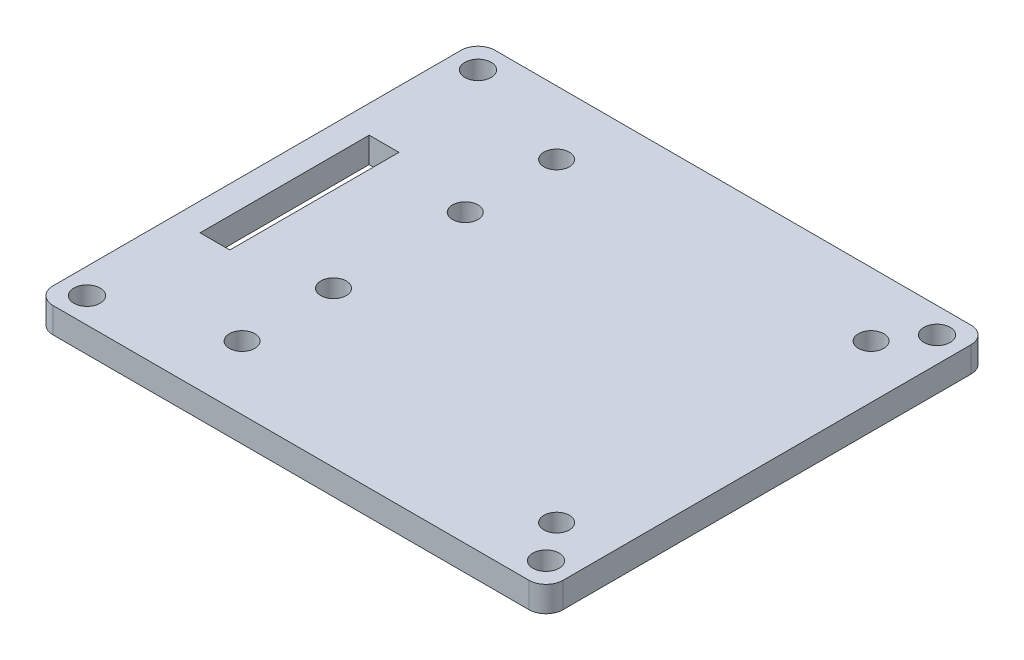
ISO-10303-21;
HEADER;
FILE_DESCRIPTION(('STEP AP214'),'2;1');
FILE_NAME('part.step','',(''),(''),'','','');
FILE_SCHEMA(('AUTOMOTIVE_DESIGN { 1 0 10303 214 1 1 1 1 }'));
ENDSEC;
DATA;
#1=APPLICATION_CONTEXT('core data for automotive mechanical design processes');
#2=APPLICATION_PROTOCOL_DEFINITION('international standard','automotive_design',2000,#1);
#3=PRODUCT_CONTEXT('',#1,'mechanical');
#4=PRODUCT('Part','Part','',(#3));
#5=PRODUCT_RELATED_PRODUCT_CATEGORY('part','',(#4));
#6=PRODUCT_DEFINITION_FORMATION('','',#4);
#7=PRODUCT_DEFINITION_CONTEXT('part definition',#1,'design');
#8=PRODUCT_DEFINITION('design','',#6,#7);
#9=PRODUCT_DEFINITION_SHAPE('','',#8);
#10=(LENGTH_UNIT() NAMED_UNIT(*) SI_UNIT(.MILLI.,.METRE.));
#11=(NAMED_UNIT(*) PLANE_ANGLE_UNIT() SI_UNIT($,.RADIAN.));
#12=(NAMED_UNIT(*) SI_UNIT($,.STERADIAN.) SOLID_ANGLE_UNIT());
#13=UNCERTAINTY_MEASURE_WITH_UNIT(LENGTH_MEASURE(1.E-05),#10,'distance_accuracy_value','');
#14=(GEOMETRIC_REPRESENTATION_CONTEXT(3) GLOBAL_UNCERTAINTY_ASSIGNED_CONTEXT((#13)) GLOBAL_UNIT_ASSIGNED_CONTEXT((#10,
#11,#12)) REPRESENTATION_CONTEXT('',''));
#15=CARTESIAN_POINT('',(0.,0.,0.));
#16=DIRECTION('',(0.,0.,1.));
#17=DIRECTION('',(1.,0.,0.));
#18=AXIS2_PLACEMENT_3D('',#15,#16,#17);
#19=CARTESIAN_POINT('',(0.,3.,0.));
#20=DIRECTION('',(0.,1.,0.));
#21=DIRECTION('',(0.,0.,1.));
#22=AXIS2_PLACEMENT_3D('',#19,#20,#21);
#23=PLANE('',#22);
#24=CARTESIAN_POINT('',(21.75,3.,23.));
#25=DIRECTION('',(0.,1.,0.));
#26=DIRECTION('',(0.,0.,1.));
#27=AXIS2_PLACEMENT_3D('',#24,#25,#26);
#28=CIRCLE('',#27,1.55);
#29=CARTESIAN_POINT('',(21.75,3.,24.55));
#30=VERTEX_POINT('',#29);
#31=EDGE_CURVE('E574',#30,#30,#28,.T.);
#32=ORIENTED_EDGE('',*,*,#31,.F.);
#33=EDGE_LOOP('',(#32));
#34=FACE_BOUND('',#33,.T.);
#35=CARTESIAN_POINT('',(-32.25,3.,-23.));
#36=DIRECTION('',(0.,1.,0.));
#37=DIRECTION('',(0.,0.,1.));
#38=AXIS2_PLACEMENT_3D('',#35,#36,#37);
#39=CIRCLE('',#38,1.55);
#40=CARTESIAN_POINT('',(-32.25,3.,-21.45));
#41=VERTEX_POINT('',#40);
#42=EDGE_CURVE('E170',#41,#41,#39,.T.);
#43=ORIENTED_EDGE('',*,*,#42,.F.);
#44=EDGE_LOOP('',(#43));
#45=FACE_BOUND('',#44,.T.);
#46=CARTESIAN_POINT('',(-18.5,3.,7.75));
#47=DIRECTION('',(0.,1.,0.));
#48=DIRECTION('',(0.,0.,1.));
#49=AXIS2_PLACEMENT_3D('',#46,#47,#48);
#50=CIRCLE('',#49,1.49999999999998);
#51=CARTESIAN_POINT('',(-18.5,3.,9.24999999999998));
#52=VERTEX_POINT('',#51);
#53=EDGE_CURVE('E195',#52,#52,#50,.T.);
#54=ORIENTED_EDGE('',*,*,#53,.F.);
#55=EDGE_LOOP('',(#54));
#56=FACE_BOUND('',#55,.T.);
#57=CARTESIAN_POINT('',(18.5,3.,-18.5));
#58=DIRECTION('',(0.,1.,0.));
#59=DIRECTION('',(0.,0.,1.));
#60=AXIS2_PLACEMENT_3D('',#57,#58,#59);
#61=CIRCLE('',#60,1.5);
#62=CARTESIAN_POINT('',(18.5,3.,-17.));
#63=VERTEX_POINT('',#62);
#64=EDGE_CURVE('E211',#63,#63,#61,.T.);
#65=ORIENTED_EDGE('',*,*,#64,.F.);
#66=EDGE_LOOP('',(#65));
#67=FACE_BOUND('',#66,.T.);
#68=CARTESIAN_POINT('',(-18.5,3.,18.5));
#69=DIRECTION('',(0.,1.,0.));
#70=DIRECTION('',(0.,0.,1.));
#71=AXIS2_PLACEMENT_3D('',#68,#69,#70);
#72=CIRCLE('',#71,1.5);
#73=CARTESIAN_POINT('',(-18.5,3.,20.));
#74=VERTEX_POINT('',#73);
#75=EDGE_CURVE('E227',#74,#74,#72,.T.);
#76=ORIENTED_EDGE('',*,*,#75,.F.);
#77=EDGE_LOOP('',(#76));
#78=FACE_BOUND('',#77,.T.);
#79=DIRECTION('',(-1.,0.,0.));
#80=VECTOR('',#79,1.);
#81=CARTESIAN_POINT('',(-35.25,3.,-26.));
#82=LINE('',#81,#80);
#83=CARTESIAN_POINT('',(22.75,3.,-26.));
#84=VERTEX_POINT('',#83);
#85=CARTESIAN_POINT('',(-33.25,3.,-26.));
#86=VERTEX_POINT('',#85);
#87=EDGE_CURVE('E246',#84,#86,#82,.T.);
#88=ORIENTED_EDGE('',*,*,#87,.T.);
#89=CARTESIAN_POINT('',(-33.25,3.,-24.));
#90=DIRECTION('',(0.,1.,0.));
#91=DIRECTION('',(0.,0.,1.));
#92=AXIS2_PLACEMENT_3D('',#89,#90,#91);
#93=CIRCLE('',#92,2.);
#94=CARTESIAN_POINT('',(-35.25,3.,-24.));
#95=VERTEX_POINT('',#94);
#96=EDGE_CURVE('E297',#86,#95,#93,.T.);
#97=ORIENTED_EDGE('',*,*,#96,.T.);
#98=DIRECTION('',(0.,0.,1.));
#99=VECTOR('',#98,1.);
#100=CARTESIAN_POINT('',(-35.25,3.,-26.));
#101=LINE('',#100,#99);
#102=CARTESIAN_POINT('',(-35.25,3.,24.));
#103=VERTEX_POINT('',#102);
#104=EDGE_CURVE('E235',#95,#103,#101,.T.);
#105=ORIENTED_EDGE('',*,*,#104,.T.);
#106=CARTESIAN_POINT('',(-33.25,3.,24.));
#107=DIRECTION('',(0.,1.,0.));
#108=DIRECTION('',(0.,0.,1.));
#109=AXIS2_PLACEMENT_3D('',#106,#107,#108);
#110=CIRCLE('',#109,2.);
#111=CARTESIAN_POINT('',(-33.25,3.,26.));
#112=VERTEX_POINT('',#111);
#113=EDGE_CURVE('E294',#103,#112,#110,.T.);
#114=ORIENTED_EDGE('',*,*,#113,.T.);
#115=DIRECTION('',(1.,0.,0.));
#116=VECTOR('',#115,1.);
#117=CARTESIAN_POINT('',(-35.25,3.,26.));
#118=LINE('',#117,#116);
#119=CARTESIAN_POINT('',(22.75,3.,26.));
#120=VERTEX_POINT('',#119);
#121=EDGE_CURVE('E239',#112,#120,#118,.T.);
#122=ORIENTED_EDGE('',*,*,#121,.T.);
#123=CARTESIAN_POINT('',(22.75,3.,24.));
#124=DIRECTION('',(0.,1.,0.));
#125=DIRECTION('',(0.,0.,1.));
#126=AXIS2_PLACEMENT_3D('',#123,#124,#125);
#127=CIRCLE('',#126,2.);
#128=CARTESIAN_POINT('',(24.75,3.,24.));
#129=VERTEX_POINT('',#128);
#130=EDGE_CURVE('E61',#120,#129,#127,.T.);
#131=ORIENTED_EDGE('',*,*,#130,.T.);
#132=DIRECTION('',(0.,0.,-1.));
#133=VECTOR('',#132,1.);
#134=CARTESIAN_POINT('',(24.75,3.,-26.));
#135=LINE('',#134,#133);
#136=CARTESIAN_POINT('',(24.75,3.,-24.));
#137=VERTEX_POINT('',#136);
#138=EDGE_CURVE('E243',#129,#137,#135,.T.);
#139=ORIENTED_EDGE('',*,*,#138,.T.);
#140=CARTESIAN_POINT('',(22.75,3.,-24.));
#141=DIRECTION('',(0.,1.,0.));
#142=DIRECTION('',(0.,0.,1.));
#143=AXIS2_PLACEMENT_3D('',#140,#141,#142);
#144=CIRCLE('',#143,2.);
#145=EDGE_CURVE('E289',#137,#84,#144,.T.);
#146=ORIENTED_EDGE('',*,*,#145,.T.);
#147=EDGE_LOOP('',(#88,#97,#105,#114,#122,#131,#139,#146));
#148=FACE_BOUND('',#147,.T.);
#149=CARTESIAN_POINT('',(-18.5,3.,-18.5));
#150=DIRECTION('',(0.,1.,0.));
#151=DIRECTION('',(0.,0.,1.));
#152=AXIS2_PLACEMENT_3D('',#149,#150,#151);
#153=CIRCLE('',#152,1.5);
#154=CARTESIAN_POINT('',(-18.5,3.,-17.));
#155=VERTEX_POINT('',#154);
#156=EDGE_CURVE('E219',#155,#155,#153,.T.);
#157=ORIENTED_EDGE('',*,*,#156,.F.);
#158=EDGE_LOOP('',(#157));
#159=FACE_BOUND('',#158,.T.);
#160=CARTESIAN_POINT('',(18.5,3.,18.5));
#161=DIRECTION('',(0.,1.,0.));
#162=DIRECTION('',(0.,0.,1.));
#163=AXIS2_PLACEMENT_3D('',#160,#161,#162);
#164=CIRCLE('',#163,1.5);
#165=CARTESIAN_POINT('',(18.5,3.,20.));
#166=VERTEX_POINT('',#165);
#167=EDGE_CURVE('E203',#166,#166,#164,.T.);
#168=ORIENTED_EDGE('',*,*,#167,.F.);
#169=EDGE_LOOP('',(#168));
#170=FACE_BOUND('',#169,.T.);
#171=CARTESIAN_POINT('',(-18.5,3.,-7.75));
#172=DIRECTION('',(0.,1.,0.));
#173=DIRECTION('',(0.,0.,1.));
#174=AXIS2_PLACEMENT_3D('',#171,#172,#173);
#175=CIRCLE('',#174,1.49999999999998);
#176=CARTESIAN_POINT('',(-18.5,3.,-6.25000000000002));
#177=VERTEX_POINT('',#176);
#178=EDGE_CURVE('E187',#177,#177,#175,.T.);
#179=ORIENTED_EDGE('',*,*,#178,.F.);
#180=EDGE_LOOP('',(#179));
#181=FACE_BOUND('',#180,.T.);
#182=DIRECTION('',(-1.,0.,0.));
#183=VECTOR('',#182,1.);
#184=CARTESIAN_POINT('',(-28.5,3.,-9.95));
#185=LINE('',#184,#183);
#186=CARTESIAN_POINT('',(-28.5,3.,-9.95));
#187=VERTEX_POINT('',#186);
#188=CARTESIAN_POINT('',(-32.,3.,-9.94999999999999));
#189=VERTEX_POINT('',#188);
#190=EDGE_CURVE('E142',#187,#189,#185,.T.);
#191=ORIENTED_EDGE('',*,*,#190,.F.);
#192=DIRECTION('',(0.,0.,-1.));
#193=VECTOR('',#192,1.);
#194=CARTESIAN_POINT('',(-28.5,3.,-9.95));
#195=LINE('',#194,#193);
#196=CARTESIAN_POINT('',(-28.5,3.,9.95));
#197=VERTEX_POINT('',#196);
#198=EDGE_CURVE('E131',#197,#187,#195,.T.);
#199=ORIENTED_EDGE('',*,*,#198,.F.);
#200=DIRECTION('',(1.,0.,0.));
#201=VECTOR('',#200,1.);
#202=CARTESIAN_POINT('',(-28.5,3.,9.95));
#203=LINE('',#202,#201);
#204=CARTESIAN_POINT('',(-32.,3.,9.95));
#205=VERTEX_POINT('',#204);
#206=EDGE_CURVE('E161',#205,#197,#203,.T.);
#207=ORIENTED_EDGE('',*,*,#206,.F.);
#208=DIRECTION('',(0.,0.,1.));
#209=VECTOR('',#208,1.);
#210=CARTESIAN_POINT('',(-32.,3.,-9.94999999999999));
#211=LINE('',#210,#209);
#212=EDGE_CURVE('E157',#189,#205,#211,.T.);
#213=ORIENTED_EDGE('',*,*,#212,.F.);
#214=EDGE_LOOP('',(#191,#199,#207,#213));
#215=FACE_BOUND('',#214,.T.);
#216=CARTESIAN_POINT('',(21.75,3.,-23.));
#217=DIRECTION('',(0.,1.,0.));
#218=DIRECTION('',(0.,0.,1.));
#219=AXIS2_PLACEMENT_3D('',#216,#217,#218);
#220=CIRCLE('',#219,1.55);
#221=CARTESIAN_POINT('',(21.75,3.,-21.45));
#222=VERTEX_POINT('',#221);
#223=EDGE_CURVE('E582',#222,#222,#220,.T.);
#224=ORIENTED_EDGE('',*,*,#223,.F.);
#225=EDGE_LOOP('',(#224));
#226=FACE_BOUND('',#225,.T.);
#227=CARTESIAN_POINT('',(-32.25,3.,23.));
#228=DIRECTION('',(0.,1.,0.));
#229=DIRECTION('',(0.,0.,1.));
#230=AXIS2_PLACEMENT_3D('',#227,#228,#229);
#231=CIRCLE('',#230,1.55);
#232=CARTESIAN_POINT('',(-32.25,3.,24.55));
#233=VERTEX_POINT('',#232);
#234=EDGE_CURVE('E563',#233,#233,#231,.T.);
#235=ORIENTED_EDGE('',*,*,#234,.F.);
#236=EDGE_LOOP('',(#235));
#237=FACE_BOUND('',#236,.T.);
#238=ADVANCED_FACE('F39',(#34,#45,#56,#67,#78,#148,#159,#170,#181,#215,#226,#237),#23,.T.);
#239=CARTESIAN_POINT('',(0.,0.,0.));
#240=DIRECTION('',(0.,1.,0.));
#241=DIRECTION('',(0.,0.,1.));
#242=AXIS2_PLACEMENT_3D('',#239,#240,#241);
#243=PLANE('',#242);
#244=CARTESIAN_POINT('',(-18.5,0.,-7.75));
#245=DIRECTION('',(0.,1.,0.));
#246=DIRECTION('',(0.,0.,1.));
#247=AXIS2_PLACEMENT_3D('',#244,#245,#246);
#248=CIRCLE('',#247,1.49999999999998);
#249=CARTESIAN_POINT('',(-18.5,0.,-6.25000000000002));
#250=VERTEX_POINT('',#249);
#251=EDGE_CURVE('E151',#250,#250,#248,.T.);
#252=ORIENTED_EDGE('',*,*,#251,.T.);
#253=EDGE_LOOP('',(#252));
#254=FACE_BOUND('',#253,.T.);
#255=CARTESIAN_POINT('',(-18.5,0.,7.75));
#256=DIRECTION('',(0.,1.,0.));
#257=DIRECTION('',(0.,0.,1.));
#258=AXIS2_PLACEMENT_3D('',#255,#256,#257);
#259=CIRCLE('',#258,1.49999999999998);
#260=CARTESIAN_POINT('',(-18.5,0.,9.24999999999998));
#261=VERTEX_POINT('',#260);
#262=EDGE_CURVE('E191',#261,#261,#259,.T.);
#263=ORIENTED_EDGE('',*,*,#262,.T.);
#264=EDGE_LOOP('',(#263));
#265=FACE_BOUND('',#264,.T.);
#266=CARTESIAN_POINT('',(18.5,0.,18.5));
#267=DIRECTION('',(0.,1.,0.));
#268=DIRECTION('',(0.,0.,1.));
#269=AXIS2_PLACEMENT_3D('',#266,#267,#268);
#270=CIRCLE('',#269,1.5);
#271=CARTESIAN_POINT('',(18.5,0.,20.));
#272=VERTEX_POINT('',#271);
#273=EDGE_CURVE('E199',#272,#272,#270,.T.);
#274=ORIENTED_EDGE('',*,*,#273,.T.);
#275=EDGE_LOOP('',(#274));
#276=FACE_BOUND('',#275,.T.);
#277=CARTESIAN_POINT('',(18.5,0.,-18.5));
#278=DIRECTION('',(0.,1.,0.));
#279=DIRECTION('',(0.,0.,1.));
#280=AXIS2_PLACEMENT_3D('',#277,#278,#279);
#281=CIRCLE('',#280,1.5);
#282=CARTESIAN_POINT('',(18.5,0.,-17.));
#283=VERTEX_POINT('',#282);
#284=EDGE_CURVE('E207',#283,#283,#281,.T.);
#285=ORIENTED_EDGE('',*,*,#284,.T.);
#286=EDGE_LOOP('',(#285));
#287=FACE_BOUND('',#286,.T.);
#288=CARTESIAN_POINT('',(-18.5,0.,-18.5));
#289=DIRECTION('',(0.,1.,0.));
#290=DIRECTION('',(0.,0.,1.));
#291=AXIS2_PLACEMENT_3D('',#288,#289,#290);
#292=CIRCLE('',#291,1.5);
#293=CARTESIAN_POINT('',(-18.5,0.,-17.));
#294=VERTEX_POINT('',#293);
#295=EDGE_CURVE('E215',#294,#294,#292,.T.);
#296=ORIENTED_EDGE('',*,*,#295,.T.);
#297=EDGE_LOOP('',(#296));
#298=FACE_BOUND('',#297,.T.);
#299=CARTESIAN_POINT('',(-18.5,0.,18.5));
#300=DIRECTION('',(0.,1.,0.));
#301=DIRECTION('',(0.,0.,1.));
#302=AXIS2_PLACEMENT_3D('',#299,#300,#301);
#303=CIRCLE('',#302,1.5);
#304=CARTESIAN_POINT('',(-18.5,0.,20.));
#305=VERTEX_POINT('',#304);
#306=EDGE_CURVE('E223',#305,#305,#303,.T.);
#307=ORIENTED_EDGE('',*,*,#306,.T.);
#308=EDGE_LOOP('',(#307));
#309=FACE_BOUND('',#308,.T.);
#310=DIRECTION('',(0.,0.,1.));
#311=VECTOR('',#310,1.);
#312=CARTESIAN_POINT('',(-35.25,0.,-26.));
#313=LINE('',#312,#311);
#314=CARTESIAN_POINT('',(-35.25,0.,-24.));
#315=VERTEX_POINT('',#314);
#316=CARTESIAN_POINT('',(-35.25,0.,24.));
#317=VERTEX_POINT('',#316);
#318=EDGE_CURVE('E231',#315,#317,#313,.T.);
#319=ORIENTED_EDGE('',*,*,#318,.F.);
#320=CARTESIAN_POINT('',(-33.25,0.,-24.));
#321=DIRECTION('',(0.,1.,0.));
#322=DIRECTION('',(0.,0.,1.));
#323=AXIS2_PLACEMENT_3D('',#320,#321,#322);
#324=CIRCLE('',#323,2.);
#325=CARTESIAN_POINT('',(-33.25,0.,-26.));
#326=VERTEX_POINT('',#325);
#327=EDGE_CURVE('E279',#315,#326,#324,.F.);
#328=ORIENTED_EDGE('',*,*,#327,.T.);
#329=DIRECTION('',(-1.,0.,0.));
#330=VECTOR('',#329,1.);
#331=CARTESIAN_POINT('',(-35.25,0.,-26.));
#332=LINE('',#331,#330);
#333=CARTESIAN_POINT('',(22.75,0.,-26.));
#334=VERTEX_POINT('',#333);
#335=EDGE_CURVE('E240',#334,#326,#332,.T.);
#336=ORIENTED_EDGE('',*,*,#335,.F.);
#337=CARTESIAN_POINT('',(22.75,0.,-24.));
#338=DIRECTION('',(0.,1.,0.));
#339=DIRECTION('',(0.,0.,1.));
#340=AXIS2_PLACEMENT_3D('',#337,#338,#339);
#341=CIRCLE('',#340,2.);
#342=CARTESIAN_POINT('',(24.75,0.,-24.));
#343=VERTEX_POINT('',#342);
#344=EDGE_CURVE('E270',#334,#343,#341,.F.);
#345=ORIENTED_EDGE('',*,*,#344,.T.);
#346=DIRECTION('',(0.,0.,-1.));
#347=VECTOR('',#346,1.);
#348=CARTESIAN_POINT('',(24.75,0.,-26.));
#349=LINE('',#348,#347);
#350=CARTESIAN_POINT('',(24.75,0.,24.));
#351=VERTEX_POINT('',#350);
#352=EDGE_CURVE('E258',#351,#343,#349,.T.);
#353=ORIENTED_EDGE('',*,*,#352,.F.);
#354=CARTESIAN_POINT('',(22.75,0.,24.));
#355=DIRECTION('',(0.,1.,0.));
#356=DIRECTION('',(0.,0.,1.));
#357=AXIS2_PLACEMENT_3D('',#354,#355,#356);
#358=CIRCLE('',#357,2.);
#359=CARTESIAN_POINT('',(22.75,0.,26.));
#360=VERTEX_POINT('',#359);
#361=EDGE_CURVE('E273',#351,#360,#358,.F.);
#362=ORIENTED_EDGE('',*,*,#361,.T.);
#363=DIRECTION('',(1.,0.,0.));
#364=VECTOR('',#363,1.);
#365=CARTESIAN_POINT('',(-35.25,0.,26.));
#366=LINE('',#365,#364);
#367=CARTESIAN_POINT('',(-33.25,0.,26.));
#368=VERTEX_POINT('',#367);
#369=EDGE_CURVE('E254',#368,#360,#366,.T.);
#370=ORIENTED_EDGE('',*,*,#369,.F.);
#371=CARTESIAN_POINT('',(-33.25,0.,24.));
#372=DIRECTION('',(0.,1.,0.));
#373=DIRECTION('',(0.,0.,1.));
#374=AXIS2_PLACEMENT_3D('',#371,#372,#373);
#375=CIRCLE('',#374,2.);
#376=EDGE_CURVE('E276',#368,#317,#375,.F.);
#377=ORIENTED_EDGE('',*,*,#376,.T.);
#378=EDGE_LOOP('',(#319,#328,#336,#345,#353,#362,#370,#377));
#379=FACE_BOUND('',#378,.T.);
#380=DIRECTION('',(0.,0.,-1.));
#381=VECTOR('',#380,1.);
#382=CARTESIAN_POINT('',(-28.5,0.,-9.95));
#383=LINE('',#382,#381);
#384=CARTESIAN_POINT('',(-28.5,0.,9.95));
#385=VERTEX_POINT('',#384);
#386=CARTESIAN_POINT('',(-28.5,0.,-9.95));
#387=VERTEX_POINT('',#386);
#388=EDGE_CURVE('E167',#385,#387,#383,.T.);
#389=ORIENTED_EDGE('',*,*,#388,.T.);
#390=DIRECTION('',(-1.,0.,0.));
#391=VECTOR('',#390,1.);
#392=CARTESIAN_POINT('',(-28.5,0.,-9.95));
#393=LINE('',#392,#391);
#394=CARTESIAN_POINT('',(-32.,0.,-9.94999999999999));
#395=VERTEX_POINT('',#394);
#396=EDGE_CURVE('E149',#387,#395,#393,.T.);
#397=ORIENTED_EDGE('',*,*,#396,.T.);
#398=DIRECTION('',(0.,0.,1.));
#399=VECTOR('',#398,1.);
#400=CARTESIAN_POINT('',(-32.,0.,-9.94999999999999));
#401=LINE('',#400,#399);
#402=CARTESIAN_POINT('',(-32.,0.,9.95));
#403=VERTEX_POINT('',#402);
#404=EDGE_CURVE('E173',#395,#403,#401,.T.);
#405=ORIENTED_EDGE('',*,*,#404,.T.);
#406=DIRECTION('',(1.,0.,0.));
#407=VECTOR('',#406,1.);
#408=CARTESIAN_POINT('',(-28.5,0.,9.95));
#409=LINE('',#408,#407);
#410=EDGE_CURVE('E143',#403,#385,#409,.T.);
#411=ORIENTED_EDGE('',*,*,#410,.T.);
#412=EDGE_LOOP('',(#389,#397,#405,#411));
#413=FACE_BOUND('',#412,.T.);
#414=CARTESIAN_POINT('',(-32.25,0.,-23.));
#415=DIRECTION('',(0.,1.,0.));
#416=DIRECTION('',(0.,0.,1.));
#417=AXIS2_PLACEMENT_3D('',#414,#415,#416);
#418=CIRCLE('',#417,1.55);
#419=CARTESIAN_POINT('',(-32.25,0.,-21.45));
#420=VERTEX_POINT('',#419);
#421=EDGE_CURVE('E586',#420,#420,#418,.T.);
#422=ORIENTED_EDGE('',*,*,#421,.T.);
#423=EDGE_LOOP('',(#422));
#424=FACE_BOUND('',#423,.T.);
#425=CARTESIAN_POINT('',(21.75,0.,-23.));
#426=DIRECTION('',(0.,1.,0.));
#427=DIRECTION('',(0.,0.,1.));
#428=AXIS2_PLACEMENT_3D('',#425,#426,#427);
#429=CIRCLE('',#428,1.55);
#430=CARTESIAN_POINT('',(21.75,0.,-21.45));
#431=VERTEX_POINT('',#430);
#432=EDGE_CURVE('E578',#431,#431,#429,.T.);
#433=ORIENTED_EDGE('',*,*,#432,.T.);
#434=EDGE_LOOP('',(#433));
#435=FACE_BOUND('',#434,.T.);
#436=CARTESIAN_POINT('',(21.75,0.,23.));
#437=DIRECTION('',(0.,1.,0.));
#438=DIRECTION('',(0.,0.,1.));
#439=AXIS2_PLACEMENT_3D('',#436,#437,#438);
#440=CIRCLE('',#439,1.55);
#441=CARTESIAN_POINT('',(21.75,0.,24.55));
#442=VERTEX_POINT('',#441);
#443=EDGE_CURVE('E571',#442,#442,#440,.T.);
#444=ORIENTED_EDGE('',*,*,#443,.T.);
#445=EDGE_LOOP('',(#444));
#446=FACE_BOUND('',#445,.T.);
#447=CARTESIAN_POINT('',(-32.25,0.,23.));
#448=DIRECTION('',(0.,1.,0.));
#449=DIRECTION('',(0.,0.,1.));
#450=AXIS2_PLACEMENT_3D('',#447,#448,#449);
#451=CIRCLE('',#450,1.55);
#452=CARTESIAN_POINT('',(-32.25,0.,24.55));
#453=VERTEX_POINT('',#452);
#454=EDGE_CURVE('E566',#453,#453,#451,.T.);
#455=ORIENTED_EDGE('',*,*,#454,.T.);
#456=EDGE_LOOP('',(#455));
#457=FACE_BOUND('',#456,.T.);
#458=ADVANCED_FACE('F317',(#254,#265,#276,#287,#298,#309,#379,#413,#424,#435,#446,#457),#243,.F.);
#459=CARTESIAN_POINT('',(-35.25,3.,-26.));
#460=DIRECTION('',(1.,0.,0.));
#461=DIRECTION('',(0.,0.,-1.));
#462=AXIS2_PLACEMENT_3D('',#459,#460,#461);
#463=PLANE('',#462);
#464=ORIENTED_EDGE('',*,*,#104,.F.);
#465=DIRECTION('',(0.,-1.,0.));
#466=VECTOR('',#465,1.);
#467=CARTESIAN_POINT('',(-35.25,3.,-24.));
#468=LINE('',#467,#466);
#469=EDGE_CURVE('E266',#95,#315,#468,.T.);
#470=ORIENTED_EDGE('',*,*,#469,.T.);
#471=ORIENTED_EDGE('',*,*,#318,.T.);
#472=DIRECTION('',(0.,-1.,0.));
#473=VECTOR('',#472,1.);
#474=CARTESIAN_POINT('',(-35.25,3.,24.));
#475=LINE('',#474,#473);
#476=EDGE_CURVE('E250',#317,#103,#475,.F.);
#477=ORIENTED_EDGE('',*,*,#476,.T.);
#478=EDGE_LOOP('',(#464,#470,#471,#477));
#479=FACE_BOUND('',#478,.T.);
#480=ADVANCED_FACE('F339',(#479),#463,.F.);
#481=CARTESIAN_POINT('',(-35.25,3.,26.));
#482=DIRECTION('',(0.,0.,-1.));
#483=DIRECTION('',(-1.,0.,0.));
#484=AXIS2_PLACEMENT_3D('',#481,#482,#483);
#485=PLANE('',#484);
#486=ORIENTED_EDGE('',*,*,#121,.F.);
#487=DIRECTION('',(0.,-1.,0.));
#488=VECTOR('',#487,1.);
#489=CARTESIAN_POINT('',(-33.25,3.,26.));
#490=LINE('',#489,#488);
#491=EDGE_CURVE('E303',#112,#368,#490,.T.);
#492=ORIENTED_EDGE('',*,*,#491,.T.);
#493=ORIENTED_EDGE('',*,*,#369,.T.);
#494=DIRECTION('',(0.,-1.,0.));
#495=VECTOR('',#494,1.);
#496=CARTESIAN_POINT('',(22.75,3.,26.));
#497=LINE('',#496,#495);
#498=EDGE_CURVE('E300',#360,#120,#497,.F.);
#499=ORIENTED_EDGE('',*,*,#498,.T.);
#500=EDGE_LOOP('',(#486,#492,#493,#499));
#501=FACE_BOUND('',#500,.T.);
#502=ADVANCED_FACE('F311',(#501),#485,.F.);
#503=CARTESIAN_POINT('',(24.75,3.,-26.));
#504=DIRECTION('',(-1.,0.,0.));
#505=DIRECTION('',(0.,0.,1.));
#506=AXIS2_PLACEMENT_3D('',#503,#504,#505);
#507=PLANE('',#506);
#508=ORIENTED_EDGE('',*,*,#138,.F.);
#509=DIRECTION('',(0.,-1.,0.));
#510=VECTOR('',#509,1.);
#511=CARTESIAN_POINT('',(24.75,3.,24.));
#512=LINE('',#511,#510);
#513=EDGE_CURVE('E11',#129,#351,#512,.T.);
#514=ORIENTED_EDGE('',*,*,#513,.T.);
#515=ORIENTED_EDGE('',*,*,#352,.T.);
#516=DIRECTION('',(0.,-1.,0.));
#517=VECTOR('',#516,1.);
#518=CARTESIAN_POINT('',(24.75,3.,-24.));
#519=LINE('',#518,#517);
#520=EDGE_CURVE('E48',#343,#137,#519,.F.);
#521=ORIENTED_EDGE('',*,*,#520,.T.);
#522=EDGE_LOOP('',(#508,#514,#515,#521));
#523=FACE_BOUND('',#522,.T.);
#524=ADVANCED_FACE('F323',(#523),#507,.F.);
#525=CARTESIAN_POINT('',(-35.25,3.,-26.));
#526=DIRECTION('',(0.,0.,1.));
#527=DIRECTION('',(1.,0.,0.));
#528=AXIS2_PLACEMENT_3D('',#525,#526,#527);
#529=PLANE('',#528);
#530=ORIENTED_EDGE('',*,*,#335,.T.);
#531=DIRECTION('',(0.,-1.,0.));
#532=VECTOR('',#531,1.);
#533=CARTESIAN_POINT('',(-33.25,3.,-26.));
#534=LINE('',#533,#532);
#535=EDGE_CURVE('E286',#326,#86,#534,.F.);
#536=ORIENTED_EDGE('',*,*,#535,.T.);
#537=ORIENTED_EDGE('',*,*,#87,.F.);
#538=DIRECTION('',(0.,-1.,0.));
#539=VECTOR('',#538,1.);
#540=CARTESIAN_POINT('',(22.75,3.,-26.));
#541=LINE('',#540,#539);
#542=EDGE_CURVE('E282',#84,#334,#541,.T.);
#543=ORIENTED_EDGE('',*,*,#542,.T.);
#544=EDGE_LOOP('',(#530,#536,#537,#543));
#545=FACE_BOUND('',#544,.T.);
#546=ADVANCED_FACE('F331',(#545),#529,.F.);
#547=CARTESIAN_POINT('',(-18.5,3.,18.5));
#548=DIRECTION('',(0.,-1.,0.));
#549=DIRECTION('',(0.,0.,-1.));
#550=AXIS2_PLACEMENT_3D('',#547,#548,#549);
#551=CYLINDRICAL_SURFACE('',#550,1.5);
#552=ORIENTED_EDGE('',*,*,#75,.T.);
#553=EDGE_LOOP('',(#552));
#554=FACE_BOUND('',#553,.T.);
#555=ORIENTED_EDGE('',*,*,#306,.F.);
#556=EDGE_LOOP('',(#555));
#557=FACE_BOUND('',#556,.T.);
#558=ADVANCED_FACE('F361',(#554,#557),#551,.F.);
#559=CARTESIAN_POINT('',(-18.5,3.,-18.5));
#560=DIRECTION('',(0.,-1.,0.));
#561=DIRECTION('',(0.,0.,-1.));
#562=AXIS2_PLACEMENT_3D('',#559,#560,#561);
#563=CYLINDRICAL_SURFACE('',#562,1.5);
#564=ORIENTED_EDGE('',*,*,#156,.T.);
#565=EDGE_LOOP('',(#564));
#566=FACE_BOUND('',#565,.T.);
#567=ORIENTED_EDGE('',*,*,#295,.F.);
#568=EDGE_LOOP('',(#567));
#569=FACE_BOUND('',#568,.T.);
#570=ADVANCED_FACE('F394',(#566,#569),#563,.F.);
#571=CARTESIAN_POINT('',(18.5,3.,-18.5));
#572=DIRECTION('',(0.,-1.,0.));
#573=DIRECTION('',(0.,0.,-1.));
#574=AXIS2_PLACEMENT_3D('',#571,#572,#573);
#575=CYLINDRICAL_SURFACE('',#574,1.5);
#576=ORIENTED_EDGE('',*,*,#64,.T.);
#577=EDGE_LOOP('',(#576));
#578=FACE_BOUND('',#577,.T.);
#579=ORIENTED_EDGE('',*,*,#284,.F.);
#580=EDGE_LOOP('',(#579));
#581=FACE_BOUND('',#580,.T.);
#582=ADVANCED_FACE('F401',(#578,#581),#575,.F.);
#583=CARTESIAN_POINT('',(18.5,3.,18.5));
#584=DIRECTION('',(0.,-1.,0.));
#585=DIRECTION('',(0.,0.,-1.));
#586=AXIS2_PLACEMENT_3D('',#583,#584,#585);
#587=CYLINDRICAL_SURFACE('',#586,1.5);
#588=ORIENTED_EDGE('',*,*,#167,.T.);
#589=EDGE_LOOP('',(#588));
#590=FACE_BOUND('',#589,.T.);
#591=ORIENTED_EDGE('',*,*,#273,.F.);
#592=EDGE_LOOP('',(#591));
#593=FACE_BOUND('',#592,.T.);
#594=ADVANCED_FACE('F408',(#590,#593),#587,.F.);
#595=CARTESIAN_POINT('',(-18.5,3.,7.75));
#596=DIRECTION('',(0.,-1.,0.));
#597=DIRECTION('',(0.,0.,-1.));
#598=AXIS2_PLACEMENT_3D('',#595,#596,#597);
#599=CYLINDRICAL_SURFACE('',#598,1.49999999999998);
#600=ORIENTED_EDGE('',*,*,#53,.T.);
#601=EDGE_LOOP('',(#600));
#602=FACE_BOUND('',#601,.T.);
#603=ORIENTED_EDGE('',*,*,#262,.F.);
#604=EDGE_LOOP('',(#603));
#605=FACE_BOUND('',#604,.T.);
#606=ADVANCED_FACE('F416',(#602,#605),#599,.F.);
#607=CARTESIAN_POINT('',(-18.5,3.,-7.75));
#608=DIRECTION('',(0.,-1.,0.));
#609=DIRECTION('',(0.,0.,-1.));
#610=AXIS2_PLACEMENT_3D('',#607,#608,#609);
#611=CYLINDRICAL_SURFACE('',#610,1.49999999999998);
#612=ORIENTED_EDGE('',*,*,#178,.T.);
#613=EDGE_LOOP('',(#612));
#614=FACE_BOUND('',#613,.T.);
#615=ORIENTED_EDGE('',*,*,#251,.F.);
#616=EDGE_LOOP('',(#615));
#617=FACE_BOUND('',#616,.T.);
#618=ADVANCED_FACE('F424',(#614,#617),#611,.F.);
#619=CARTESIAN_POINT('',(-28.5,3.,-9.95));
#620=DIRECTION('',(-1.,0.,0.));
#621=DIRECTION('',(0.,0.,1.));
#622=AXIS2_PLACEMENT_3D('',#619,#620,#621);
#623=PLANE('',#622);
#624=ORIENTED_EDGE('',*,*,#388,.F.);
#625=DIRECTION('',(0.,-1.,0.));
#626=VECTOR('',#625,1.);
#627=CARTESIAN_POINT('',(-28.5,3.,9.95));
#628=LINE('',#627,#626);
#629=EDGE_CURVE('E137',#197,#385,#628,.T.);
#630=ORIENTED_EDGE('',*,*,#629,.F.);
#631=ORIENTED_EDGE('',*,*,#198,.T.);
#632=DIRECTION('',(0.,-1.,0.));
#633=VECTOR('',#632,1.);
#634=CARTESIAN_POINT('',(-28.5,3.,-9.95));
#635=LINE('',#634,#633);
#636=EDGE_CURVE('E134',#187,#387,#635,.T.);
#637=ORIENTED_EDGE('',*,*,#636,.T.);
#638=EDGE_LOOP('',(#624,#630,#631,#637));
#639=FACE_BOUND('',#638,.T.);
#640=ADVANCED_FACE('F133',(#639),#623,.T.);
#641=CARTESIAN_POINT('',(-28.5,3.,-9.95));
#642=DIRECTION('',(0.,0.,1.));
#643=DIRECTION('',(1.,0.,0.));
#644=AXIS2_PLACEMENT_3D('',#641,#642,#643);
#645=PLANE('',#644);
#646=ORIENTED_EDGE('',*,*,#396,.F.);
#647=ORIENTED_EDGE('',*,*,#636,.F.);
#648=ORIENTED_EDGE('',*,*,#190,.T.);
#649=DIRECTION('',(0.,-1.,0.));
#650=VECTOR('',#649,1.);
#651=CARTESIAN_POINT('',(-32.,3.,-9.94999999999999));
#652=LINE('',#651,#650);
#653=EDGE_CURVE('E152',#189,#395,#652,.T.);
#654=ORIENTED_EDGE('',*,*,#653,.T.);
#655=EDGE_LOOP('',(#646,#647,#648,#654));
#656=FACE_BOUND('',#655,.T.);
#657=ADVANCED_FACE('F146',(#656),#645,.T.);
#658=CARTESIAN_POINT('',(-32.,3.,-9.94999999999999));
#659=DIRECTION('',(1.,0.,0.));
#660=DIRECTION('',(0.,0.,-1.));
#661=AXIS2_PLACEMENT_3D('',#658,#659,#660);
#662=PLANE('',#661);
#663=ORIENTED_EDGE('',*,*,#404,.F.);
#664=ORIENTED_EDGE('',*,*,#653,.F.);
#665=ORIENTED_EDGE('',*,*,#212,.T.);
#666=DIRECTION('',(0.,-1.,0.));
#667=VECTOR('',#666,1.);
#668=CARTESIAN_POINT('',(-32.,3.,9.95));
#669=LINE('',#668,#667);
#670=EDGE_CURVE('E182',#205,#403,#669,.T.);
#671=ORIENTED_EDGE('',*,*,#670,.T.);
#672=EDGE_LOOP('',(#663,#664,#665,#671));
#673=FACE_BOUND('',#672,.T.);
#674=ADVANCED_FACE('F445',(#673),#662,.T.);
#675=CARTESIAN_POINT('',(-28.5,3.,9.95));
#676=DIRECTION('',(0.,0.,-1.));
#677=DIRECTION('',(-1.,0.,0.));
#678=AXIS2_PLACEMENT_3D('',#675,#676,#677);
#679=PLANE('',#678);
#680=ORIENTED_EDGE('',*,*,#410,.F.);
#681=ORIENTED_EDGE('',*,*,#670,.F.);
#682=ORIENTED_EDGE('',*,*,#206,.T.);
#683=ORIENTED_EDGE('',*,*,#629,.T.);
#684=EDGE_LOOP('',(#680,#681,#682,#683));
#685=FACE_BOUND('',#684,.T.);
#686=ADVANCED_FACE('F452',(#685),#679,.T.);
#687=CARTESIAN_POINT('',(-32.25,3.,-23.));
#688=DIRECTION('',(0.,-1.,0.));
#689=DIRECTION('',(0.,0.,-1.));
#690=AXIS2_PLACEMENT_3D('',#687,#688,#689);
#691=CYLINDRICAL_SURFACE('',#690,1.55);
#692=ORIENTED_EDGE('',*,*,#42,.T.);
#693=EDGE_LOOP('',(#692));
#694=FACE_BOUND('',#693,.T.);
#695=ORIENTED_EDGE('',*,*,#421,.F.);
#696=EDGE_LOOP('',(#695));
#697=FACE_BOUND('',#696,.T.);
#698=ADVANCED_FACE('F460',(#694,#697),#691,.F.);
#699=CARTESIAN_POINT('',(21.75,3.,-23.));
#700=DIRECTION('',(0.,-1.,0.));
#701=DIRECTION('',(0.,0.,-1.));
#702=AXIS2_PLACEMENT_3D('',#699,#700,#701);
#703=CYLINDRICAL_SURFACE('',#702,1.55);
#704=ORIENTED_EDGE('',*,*,#223,.T.);
#705=EDGE_LOOP('',(#704));
#706=FACE_BOUND('',#705,.T.);
#707=ORIENTED_EDGE('',*,*,#432,.F.);
#708=EDGE_LOOP('',(#707));
#709=FACE_BOUND('',#708,.T.);
#710=ADVANCED_FACE('F468',(#706,#709),#703,.F.);
#711=CARTESIAN_POINT('',(21.75,3.,23.));
#712=DIRECTION('',(0.,-1.,0.));
#713=DIRECTION('',(0.,0.,-1.));
#714=AXIS2_PLACEMENT_3D('',#711,#712,#713);
#715=CYLINDRICAL_SURFACE('',#714,1.55);
#716=ORIENTED_EDGE('',*,*,#31,.T.);
#717=EDGE_LOOP('',(#716));
#718=FACE_BOUND('',#717,.T.);
#719=ORIENTED_EDGE('',*,*,#443,.F.);
#720=EDGE_LOOP('',(#719));
#721=FACE_BOUND('',#720,.T.);
#722=ADVANCED_FACE('F476',(#718,#721),#715,.F.);
#723=CARTESIAN_POINT('',(-32.25,3.,23.));
#724=DIRECTION('',(0.,-1.,0.));
#725=DIRECTION('',(0.,0.,-1.));
#726=AXIS2_PLACEMENT_3D('',#723,#724,#725);
#727=CYLINDRICAL_SURFACE('',#726,1.55);
#728=ORIENTED_EDGE('',*,*,#234,.T.);
#729=EDGE_LOOP('',(#728));
#730=FACE_BOUND('',#729,.T.);
#731=ORIENTED_EDGE('',*,*,#454,.F.);
#732=EDGE_LOOP('',(#731));
#733=FACE_BOUND('',#732,.T.);
#734=ADVANCED_FACE('F348',(#730,#733),#727,.F.);
#735=CARTESIAN_POINT('',(-33.25,3.,-24.));
#736=DIRECTION('',(0.,-1.,0.));
#737=DIRECTION('',(0.,0.,-1.));
#738=AXIS2_PLACEMENT_3D('',#735,#736,#737);
#739=CYLINDRICAL_SURFACE('',#738,2.);
#740=ORIENTED_EDGE('',*,*,#96,.F.);
#741=ORIENTED_EDGE('',*,*,#535,.F.);
#742=ORIENTED_EDGE('',*,*,#327,.F.);
#743=ORIENTED_EDGE('',*,*,#469,.F.);
#744=EDGE_LOOP('',(#740,#741,#742,#743));
#745=FACE_BOUND('',#744,.T.);
#746=ADVANCED_FACE('F336',(#745),#739,.T.);
#747=CARTESIAN_POINT('',(-33.25,3.,24.));
#748=DIRECTION('',(0.,-1.,0.));
#749=DIRECTION('',(0.,0.,-1.));
#750=AXIS2_PLACEMENT_3D('',#747,#748,#749);
#751=CYLINDRICAL_SURFACE('',#750,2.);
#752=ORIENTED_EDGE('',*,*,#113,.F.);
#753=ORIENTED_EDGE('',*,*,#476,.F.);
#754=ORIENTED_EDGE('',*,*,#376,.F.);
#755=ORIENTED_EDGE('',*,*,#491,.F.);
#756=EDGE_LOOP('',(#752,#753,#754,#755));
#757=FACE_BOUND('',#756,.T.);
#758=ADVANCED_FACE('F341',(#757),#751,.T.);
#759=CARTESIAN_POINT('',(22.75,3.,24.));
#760=DIRECTION('',(0.,-1.,0.));
#761=DIRECTION('',(0.,0.,-1.));
#762=AXIS2_PLACEMENT_3D('',#759,#760,#761);
#763=CYLINDRICAL_SURFACE('',#762,2.);
#764=ORIENTED_EDGE('',*,*,#130,.F.);
#765=ORIENTED_EDGE('',*,*,#498,.F.);
#766=ORIENTED_EDGE('',*,*,#361,.F.);
#767=ORIENTED_EDGE('',*,*,#513,.F.);
#768=EDGE_LOOP('',(#764,#765,#766,#767));
#769=FACE_BOUND('',#768,.T.);
#770=ADVANCED_FACE('F322',(#769),#763,.T.);
#771=CARTESIAN_POINT('',(22.75,3.,-24.));
#772=DIRECTION('',(0.,-1.,0.));
#773=DIRECTION('',(0.,0.,-1.));
#774=AXIS2_PLACEMENT_3D('',#771,#772,#773);
#775=CYLINDRICAL_SURFACE('',#774,2.);
#776=ORIENTED_EDGE('',*,*,#145,.F.);
#777=ORIENTED_EDGE('',*,*,#520,.F.);
#778=ORIENTED_EDGE('',*,*,#344,.F.);
#779=ORIENTED_EDGE('',*,*,#542,.F.);
#780=EDGE_LOOP('',(#776,#777,#778,#779));
#781=FACE_BOUND('',#780,.T.);
#782=ADVANCED_FACE('F41',(#781),#775,.T.);
#783=CLOSED_SHELL('',(#238,#458,#480,#502,#524,#546,#558,#570,#582,#594,#606,#618,#640,#657,
#674,#686,#698,#710,#722,#734,#746,#758,#770,#782));
#784=MANIFOLD_SOLID_BREP('B2',#783);
#785=ADVANCED_BREP_SHAPE_REPRESENTATION('',(#18,#784),#14);
#786=SHAPE_DEFINITION_REPRESENTATION(#9,#785);
ENDSEC;
END-ISO-10303-21;
